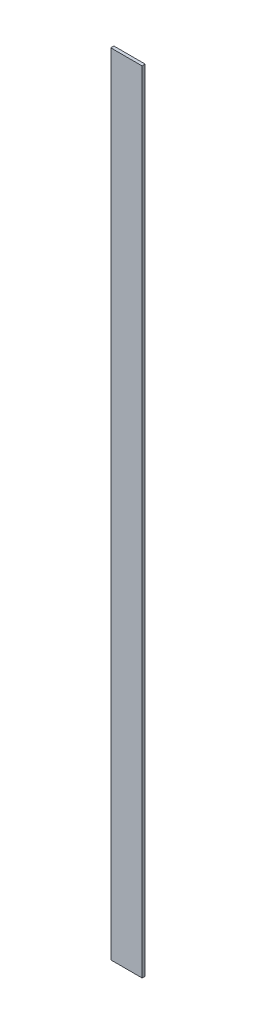
ISO-10303-21;
HEADER;
FILE_DESCRIPTION(('STEP AP214'),'2;1');
FILE_NAME('part.step','',(''),(''),'','','');
FILE_SCHEMA(('AUTOMOTIVE_DESIGN { 1 0 10303 214 1 1 1 1 }'));
ENDSEC;
DATA;
#1=APPLICATION_CONTEXT('core data for automotive mechanical design processes');
#2=APPLICATION_PROTOCOL_DEFINITION('international standard','automotive_design',2000,#1);
#3=PRODUCT_CONTEXT('',#1,'mechanical');
#4=PRODUCT('Part','Part','',(#3));
#5=PRODUCT_RELATED_PRODUCT_CATEGORY('part','',(#4));
#6=PRODUCT_DEFINITION_FORMATION('','',#4);
#7=PRODUCT_DEFINITION_CONTEXT('part definition',#1,'design');
#8=PRODUCT_DEFINITION('design','',#6,#7);
#9=PRODUCT_DEFINITION_SHAPE('','',#8);
#10=(LENGTH_UNIT() NAMED_UNIT(*) SI_UNIT(.MILLI.,.METRE.));
#11=(NAMED_UNIT(*) PLANE_ANGLE_UNIT() SI_UNIT($,.RADIAN.));
#12=(NAMED_UNIT(*) SI_UNIT($,.STERADIAN.) SOLID_ANGLE_UNIT());
#13=UNCERTAINTY_MEASURE_WITH_UNIT(LENGTH_MEASURE(1.E-05),#10,'distance_accuracy_value','');
#14=(GEOMETRIC_REPRESENTATION_CONTEXT(3) GLOBAL_UNCERTAINTY_ASSIGNED_CONTEXT((#13)) GLOBAL_UNIT_ASSIGNED_CONTEXT((#10,
#11,#12)) REPRESENTATION_CONTEXT('',''));
#15=CARTESIAN_POINT('',(0.,0.,0.));
#16=DIRECTION('',(0.,0.,1.));
#17=DIRECTION('',(1.,0.,0.));
#18=AXIS2_PLACEMENT_3D('',#15,#16,#17);
#19=CARTESIAN_POINT('',(-139.,126.,1.));
#20=DIRECTION('',(1.,0.,0.));
#21=DIRECTION('',(0.,0.,-1.));
#22=AXIS2_PLACEMENT_3D('',#19,#20,#21);
#23=PLANE('',#22);
#24=DIRECTION('',(0.,-1.,0.));
#25=VECTOR('',#24,1.);
#26=CARTESIAN_POINT('',(-139.,126.,0.));
#27=LINE('',#26,#25);
#28=CARTESIAN_POINT('',(-139.,126.,0.));
#29=VERTEX_POINT('',#28);
#30=CARTESIAN_POINT('',(-139.,-126.,0.));
#31=VERTEX_POINT('',#30);
#32=EDGE_CURVE('E115',#29,#31,#27,.T.);
#33=ORIENTED_EDGE('',*,*,#32,.T.);
#34=DIRECTION('',(0.,0.,-1.));
#35=VECTOR('',#34,1.);
#36=CARTESIAN_POINT('',(-139.,-126.,1.));
#37=LINE('',#36,#35);
#38=CARTESIAN_POINT('',(-139.,-126.,1.));
#39=VERTEX_POINT('',#38);
#40=EDGE_CURVE('E11',#39,#31,#37,.T.);
#41=ORIENTED_EDGE('',*,*,#40,.F.);
#42=DIRECTION('',(0.,-1.,0.));
#43=VECTOR('',#42,1.);
#44=CARTESIAN_POINT('',(-139.,126.,1.));
#45=LINE('',#44,#43);
#46=CARTESIAN_POINT('',(-139.,126.,1.));
#47=VERTEX_POINT('',#46);
#48=EDGE_CURVE('E97',#47,#39,#45,.T.);
#49=ORIENTED_EDGE('',*,*,#48,.F.);
#50=DIRECTION('',(0.,0.,-1.));
#51=VECTOR('',#50,1.);
#52=CARTESIAN_POINT('',(-139.,126.,1.));
#53=LINE('',#52,#51);
#54=EDGE_CURVE('E111',#47,#29,#53,.T.);
#55=ORIENTED_EDGE('',*,*,#54,.T.);
#56=EDGE_LOOP('',(#33,#41,#49,#55));
#57=FACE_BOUND('',#56,.T.);
#58=ADVANCED_FACE('F45',(#57),#23,.F.);
#59=CARTESIAN_POINT('',(-139.,-126.,1.));
#60=DIRECTION('',(0.,1.,0.));
#61=DIRECTION('',(0.,0.,1.));
#62=AXIS2_PLACEMENT_3D('',#59,#60,#61);
#63=PLANE('',#62);
#64=DIRECTION('',(1.,0.,0.));
#65=VECTOR('',#64,1.);
#66=CARTESIAN_POINT('',(-139.,-126.,0.));
#67=LINE('',#66,#65);
#68=CARTESIAN_POINT('',(-129.,-126.,0.));
#69=VERTEX_POINT('',#68);
#70=EDGE_CURVE('E102',#31,#69,#67,.T.);
#71=ORIENTED_EDGE('',*,*,#70,.T.);
#72=DIRECTION('',(0.,0.,-1.));
#73=VECTOR('',#72,1.);
#74=CARTESIAN_POINT('',(-129.,-126.,1.));
#75=LINE('',#74,#73);
#76=CARTESIAN_POINT('',(-129.,-126.,1.));
#77=VERTEX_POINT('',#76);
#78=EDGE_CURVE('E54',#77,#69,#75,.T.);
#79=ORIENTED_EDGE('',*,*,#78,.F.);
#80=DIRECTION('',(1.,0.,0.));
#81=VECTOR('',#80,1.);
#82=CARTESIAN_POINT('',(-139.,-126.,1.));
#83=LINE('',#82,#81);
#84=EDGE_CURVE('E92',#39,#77,#83,.T.);
#85=ORIENTED_EDGE('',*,*,#84,.F.);
#86=ORIENTED_EDGE('',*,*,#40,.T.);
#87=EDGE_LOOP('',(#71,#79,#85,#86));
#88=FACE_BOUND('',#87,.T.);
#89=ADVANCED_FACE('F101',(#88),#63,.F.);
#90=CARTESIAN_POINT('',(-129.,-126.,1.));
#91=DIRECTION('',(-1.,0.,0.));
#92=DIRECTION('',(0.,0.,1.));
#93=AXIS2_PLACEMENT_3D('',#90,#91,#92);
#94=PLANE('',#93);
#95=DIRECTION('',(0.,1.,0.));
#96=VECTOR('',#95,1.);
#97=CARTESIAN_POINT('',(-129.,-126.,0.));
#98=LINE('',#97,#96);
#99=CARTESIAN_POINT('',(-129.,126.,0.));
#100=VERTEX_POINT('',#99);
#101=EDGE_CURVE('E79',#69,#100,#98,.T.);
#102=ORIENTED_EDGE('',*,*,#101,.T.);
#103=DIRECTION('',(0.,0.,-1.));
#104=VECTOR('',#103,1.);
#105=CARTESIAN_POINT('',(-129.,126.,1.));
#106=LINE('',#105,#104);
#107=CARTESIAN_POINT('',(-129.,126.,1.));
#108=VERTEX_POINT('',#107);
#109=EDGE_CURVE('E104',#108,#100,#106,.T.);
#110=ORIENTED_EDGE('',*,*,#109,.F.);
#111=DIRECTION('',(0.,1.,0.));
#112=VECTOR('',#111,1.);
#113=CARTESIAN_POINT('',(-129.,-126.,1.));
#114=LINE('',#113,#112);
#115=EDGE_CURVE('E95',#77,#108,#114,.T.);
#116=ORIENTED_EDGE('',*,*,#115,.F.);
#117=ORIENTED_EDGE('',*,*,#78,.T.);
#118=EDGE_LOOP('',(#102,#110,#116,#117));
#119=FACE_BOUND('',#118,.T.);
#120=ADVANCED_FACE('F105',(#119),#94,.F.);
#121=CARTESIAN_POINT('',(-129.,126.,1.));
#122=DIRECTION('',(0.,-1.,0.));
#123=DIRECTION('',(0.,0.,-1.));
#124=AXIS2_PLACEMENT_3D('',#121,#122,#123);
#125=PLANE('',#124);
#126=DIRECTION('',(-1.,0.,0.));
#127=VECTOR('',#126,1.);
#128=CARTESIAN_POINT('',(-129.,126.,0.));
#129=LINE('',#128,#127);
#130=EDGE_CURVE('E85',#100,#29,#129,.T.);
#131=ORIENTED_EDGE('',*,*,#130,.T.);
#132=ORIENTED_EDGE('',*,*,#54,.F.);
#133=DIRECTION('',(-1.,0.,0.));
#134=VECTOR('',#133,1.);
#135=CARTESIAN_POINT('',(-129.,126.,1.));
#136=LINE('',#135,#134);
#137=EDGE_CURVE('E62',#108,#47,#136,.T.);
#138=ORIENTED_EDGE('',*,*,#137,.F.);
#139=ORIENTED_EDGE('',*,*,#109,.T.);
#140=EDGE_LOOP('',(#131,#132,#138,#139));
#141=FACE_BOUND('',#140,.T.);
#142=ADVANCED_FACE('F126',(#141),#125,.F.);
#143=CARTESIAN_POINT('',(0.,0.,1.));
#144=DIRECTION('',(0.,0.,1.));
#145=DIRECTION('',(1.,0.,0.));
#146=AXIS2_PLACEMENT_3D('',#143,#144,#145);
#147=PLANE('',#146);
#148=ORIENTED_EDGE('',*,*,#48,.T.);
#149=ORIENTED_EDGE('',*,*,#84,.T.);
#150=ORIENTED_EDGE('',*,*,#115,.T.);
#151=ORIENTED_EDGE('',*,*,#137,.T.);
#152=EDGE_LOOP('',(#148,#149,#150,#151));
#153=FACE_BOUND('',#152,.T.);
#154=ADVANCED_FACE('F93',(#153),#147,.T.);
#155=CARTESIAN_POINT('',(0.,0.,0.));
#156=DIRECTION('',(0.,0.,1.));
#157=DIRECTION('',(1.,0.,0.));
#158=AXIS2_PLACEMENT_3D('',#155,#156,#157);
#159=PLANE('',#158);
#160=ORIENTED_EDGE('',*,*,#32,.F.);
#161=ORIENTED_EDGE('',*,*,#130,.F.);
#162=ORIENTED_EDGE('',*,*,#101,.F.);
#163=ORIENTED_EDGE('',*,*,#70,.F.);
#164=EDGE_LOOP('',(#160,#161,#162,#163));
#165=FACE_BOUND('',#164,.T.);
#166=ADVANCED_FACE('F129',(#165),#159,.F.);
#167=CLOSED_SHELL('',(#58,#89,#120,#142,#154,#166));
#168=MANIFOLD_SOLID_BREP('B2',#167);
#169=ADVANCED_BREP_SHAPE_REPRESENTATION('',(#18,#168),#14);
#170=SHAPE_DEFINITION_REPRESENTATION(#9,#169);
ENDSEC;
END-ISO-10303-21;
